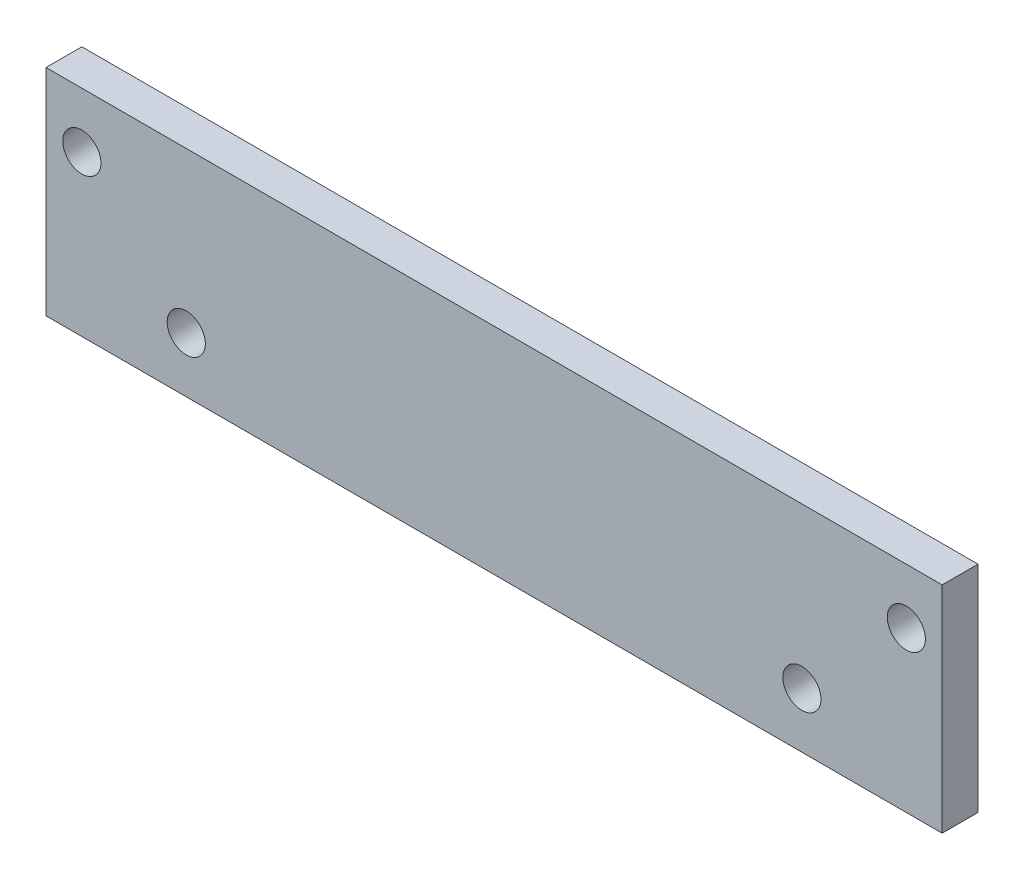
ISO-10303-21;
HEADER;
FILE_DESCRIPTION(('STEP AP214'),'2;1');
FILE_NAME('part.step','',(''),(''),'','','');
FILE_SCHEMA(('AUTOMOTIVE_DESIGN { 1 0 10303 214 1 1 1 1 }'));
ENDSEC;
DATA;
#1=APPLICATION_CONTEXT('core data for automotive mechanical design processes');
#2=APPLICATION_PROTOCOL_DEFINITION('international standard','automotive_design',2000,#1);
#3=PRODUCT_CONTEXT('',#1,'mechanical');
#4=PRODUCT('Part','Part','',(#3));
#5=PRODUCT_RELATED_PRODUCT_CATEGORY('part','',(#4));
#6=PRODUCT_DEFINITION_FORMATION('','',#4);
#7=PRODUCT_DEFINITION_CONTEXT('part definition',#1,'design');
#8=PRODUCT_DEFINITION('design','',#6,#7);
#9=PRODUCT_DEFINITION_SHAPE('','',#8);
#10=(LENGTH_UNIT() NAMED_UNIT(*) SI_UNIT(.MILLI.,.METRE.));
#11=(NAMED_UNIT(*) PLANE_ANGLE_UNIT() SI_UNIT($,.RADIAN.));
#12=(NAMED_UNIT(*) SI_UNIT($,.STERADIAN.) SOLID_ANGLE_UNIT());
#13=UNCERTAINTY_MEASURE_WITH_UNIT(LENGTH_MEASURE(1.E-05),#10,'distance_accuracy_value','');
#14=(GEOMETRIC_REPRESENTATION_CONTEXT(3) GLOBAL_UNCERTAINTY_ASSIGNED_CONTEXT((#13)) GLOBAL_UNIT_ASSIGNED_CONTEXT((#10,
#11,#12)) REPRESENTATION_CONTEXT('',''));
#15=CARTESIAN_POINT('',(0.,0.,0.));
#16=DIRECTION('',(0.,0.,1.));
#17=DIRECTION('',(1.,0.,0.));
#18=AXIS2_PLACEMENT_3D('',#15,#16,#17);
#19=CARTESIAN_POINT('',(0.,0.,6.35));
#20=DIRECTION('',(0.,0.,-1.));
#21=DIRECTION('',(-1.,0.,0.));
#22=AXIS2_PLACEMENT_3D('',#19,#20,#21);
#23=PLANE('',#22);
#24=DIRECTION('',(0.,1.,0.));
#25=VECTOR('',#24,1.);
#26=CARTESIAN_POINT('',(79.375,-19.05,6.35));
#27=LINE('',#26,#25);
#28=CARTESIAN_POINT('',(79.375,-19.05,6.35));
#29=VERTEX_POINT('',#28);
#30=CARTESIAN_POINT('',(79.375,19.05,6.35));
#31=VERTEX_POINT('',#30);
#32=EDGE_CURVE('E87',#29,#31,#27,.T.);
#33=ORIENTED_EDGE('',*,*,#32,.T.);
#34=DIRECTION('',(-1.,0.,0.));
#35=VECTOR('',#34,1.);
#36=CARTESIAN_POINT('',(-79.375,19.05,6.35));
#37=LINE('',#36,#35);
#38=CARTESIAN_POINT('',(-79.375,19.05,6.35));
#39=VERTEX_POINT('',#38);
#40=EDGE_CURVE('E82',#31,#39,#37,.T.);
#41=ORIENTED_EDGE('',*,*,#40,.T.);
#42=DIRECTION('',(0.,-1.,0.));
#43=VECTOR('',#42,1.);
#44=CARTESIAN_POINT('',(-79.375,-19.05,6.35));
#45=LINE('',#44,#43);
#46=CARTESIAN_POINT('',(-79.375,-19.05,6.35));
#47=VERTEX_POINT('',#46);
#48=EDGE_CURVE('E85',#39,#47,#45,.T.);
#49=ORIENTED_EDGE('',*,*,#48,.T.);
#50=DIRECTION('',(1.,0.,0.));
#51=VECTOR('',#50,1.);
#52=CARTESIAN_POINT('',(-79.375,-19.05,6.35));
#53=LINE('',#52,#51);
#54=EDGE_CURVE('E52',#47,#29,#53,.T.);
#55=ORIENTED_EDGE('',*,*,#54,.T.);
#56=EDGE_LOOP('',(#33,#41,#49,#55));
#57=FACE_BOUND('',#56,.T.);
#58=CARTESIAN_POINT('',(-54.5256723905975,-9.24966380470121,6.35));
#59=DIRECTION('',(0.,0.,1.));
#60=DIRECTION('',(1.,0.,0.));
#61=AXIS2_PLACEMENT_3D('',#58,#59,#60);
#62=CIRCLE('',#61,3.37819999999998);
#63=CARTESIAN_POINT('',(-51.1474723905975,-9.24966380470121,6.35));
#64=VERTEX_POINT('',#63);
#65=EDGE_CURVE('E116',#64,#64,#62,.T.);
#66=ORIENTED_EDGE('',*,*,#65,.F.);
#67=EDGE_LOOP('',(#66));
#68=FACE_BOUND('',#67,.T.);
#69=CARTESIAN_POINT('',(-73.025,9.24966380470121,6.35));
#70=DIRECTION('',(0.,0.,1.));
#71=DIRECTION('',(1.,0.,0.));
#72=AXIS2_PLACEMENT_3D('',#69,#70,#71);
#73=CIRCLE('',#72,3.37819999999998);
#74=CARTESIAN_POINT('',(-69.6468,9.24966380470121,6.35));
#75=VERTEX_POINT('',#74);
#76=EDGE_CURVE('E122',#75,#75,#73,.T.);
#77=ORIENTED_EDGE('',*,*,#76,.F.);
#78=EDGE_LOOP('',(#77));
#79=FACE_BOUND('',#78,.T.);
#80=CARTESIAN_POINT('',(54.5256723905975,-9.24966380470121,6.35));
#81=DIRECTION('',(0.,0.,1.));
#82=DIRECTION('',(1.,0.,0.));
#83=AXIS2_PLACEMENT_3D('',#80,#81,#82);
#84=CIRCLE('',#83,3.37819999999998);
#85=CARTESIAN_POINT('',(57.9038723905975,-9.24966380470121,6.35));
#86=VERTEX_POINT('',#85);
#87=EDGE_CURVE('E128',#86,#86,#84,.T.);
#88=ORIENTED_EDGE('',*,*,#87,.F.);
#89=EDGE_LOOP('',(#88));
#90=FACE_BOUND('',#89,.T.);
#91=CARTESIAN_POINT('',(73.025,9.24966380470121,6.35));
#92=DIRECTION('',(0.,0.,1.));
#93=DIRECTION('',(1.,0.,0.));
#94=AXIS2_PLACEMENT_3D('',#91,#92,#93);
#95=CIRCLE('',#94,3.37819999999998);
#96=CARTESIAN_POINT('',(76.4032,9.24966380470121,6.35));
#97=VERTEX_POINT('',#96);
#98=EDGE_CURVE('E134',#97,#97,#95,.T.);
#99=ORIENTED_EDGE('',*,*,#98,.F.);
#100=EDGE_LOOP('',(#99));
#101=FACE_BOUND('',#100,.T.);
#102=ADVANCED_FACE('F35',(#57,#68,#79,#90,#101),#23,.F.);
#103=CARTESIAN_POINT('',(0.,0.,0.));
#104=DIRECTION('',(0.,0.,-1.));
#105=DIRECTION('',(-1.,0.,0.));
#106=AXIS2_PLACEMENT_3D('',#103,#104,#105);
#107=PLANE('',#106);
#108=CARTESIAN_POINT('',(73.025,9.24966380470121,0.));
#109=DIRECTION('',(0.,0.,1.));
#110=DIRECTION('',(1.,0.,0.));
#111=AXIS2_PLACEMENT_3D('',#108,#109,#110);
#112=CIRCLE('',#111,3.3782);
#113=CARTESIAN_POINT('',(76.4032,9.24966380470121,0.));
#114=VERTEX_POINT('',#113);
#115=EDGE_CURVE('E131',#114,#114,#112,.T.);
#116=ORIENTED_EDGE('',*,*,#115,.T.);
#117=EDGE_LOOP('',(#116));
#118=FACE_BOUND('',#117,.T.);
#119=DIRECTION('',(0.,1.,0.));
#120=VECTOR('',#119,1.);
#121=CARTESIAN_POINT('',(79.375,-19.05,0.));
#122=LINE('',#121,#120);
#123=CARTESIAN_POINT('',(79.375,-19.05,0.));
#124=VERTEX_POINT('',#123);
#125=CARTESIAN_POINT('',(79.375,19.05,0.));
#126=VERTEX_POINT('',#125);
#127=EDGE_CURVE('E99',#124,#126,#122,.T.);
#128=ORIENTED_EDGE('',*,*,#127,.F.);
#129=DIRECTION('',(1.,0.,0.));
#130=VECTOR('',#129,1.);
#131=CARTESIAN_POINT('',(-79.375,-19.05,0.));
#132=LINE('',#131,#130);
#133=CARTESIAN_POINT('',(-79.375,-19.05,0.));
#134=VERTEX_POINT('',#133);
#135=EDGE_CURVE('E75',#134,#124,#132,.T.);
#136=ORIENTED_EDGE('',*,*,#135,.F.);
#137=DIRECTION('',(0.,-1.,0.));
#138=VECTOR('',#137,1.);
#139=CARTESIAN_POINT('',(-79.375,-19.05,0.));
#140=LINE('',#139,#138);
#141=CARTESIAN_POINT('',(-79.375,19.05,0.));
#142=VERTEX_POINT('',#141);
#143=EDGE_CURVE('E69',#142,#134,#140,.T.);
#144=ORIENTED_EDGE('',*,*,#143,.F.);
#145=DIRECTION('',(-1.,0.,0.));
#146=VECTOR('',#145,1.);
#147=CARTESIAN_POINT('',(-79.375,19.05,0.));
#148=LINE('',#147,#146);
#149=EDGE_CURVE('E91',#126,#142,#148,.T.);
#150=ORIENTED_EDGE('',*,*,#149,.F.);
#151=EDGE_LOOP('',(#128,#136,#144,#150));
#152=FACE_BOUND('',#151,.T.);
#153=CARTESIAN_POINT('',(-54.5256723905975,-9.24966380470121,0.));
#154=DIRECTION('',(0.,0.,1.));
#155=DIRECTION('',(1.,0.,0.));
#156=AXIS2_PLACEMENT_3D('',#153,#154,#155);
#157=CIRCLE('',#156,3.3782);
#158=CARTESIAN_POINT('',(-51.1474723905975,-9.24966380470121,0.));
#159=VERTEX_POINT('',#158);
#160=EDGE_CURVE('E102',#159,#159,#157,.T.);
#161=ORIENTED_EDGE('',*,*,#160,.T.);
#162=EDGE_LOOP('',(#161));
#163=FACE_BOUND('',#162,.T.);
#164=CARTESIAN_POINT('',(-73.025,9.24966380470121,0.));
#165=DIRECTION('',(0.,0.,1.));
#166=DIRECTION('',(1.,0.,0.));
#167=AXIS2_PLACEMENT_3D('',#164,#165,#166);
#168=CIRCLE('',#167,3.3782);
#169=CARTESIAN_POINT('',(-69.6468,9.24966380470121,0.));
#170=VERTEX_POINT('',#169);
#171=EDGE_CURVE('E119',#170,#170,#168,.T.);
#172=ORIENTED_EDGE('',*,*,#171,.T.);
#173=EDGE_LOOP('',(#172));
#174=FACE_BOUND('',#173,.T.);
#175=CARTESIAN_POINT('',(54.5256723905975,-9.24966380470121,0.));
#176=DIRECTION('',(0.,0.,1.));
#177=DIRECTION('',(1.,0.,0.));
#178=AXIS2_PLACEMENT_3D('',#175,#176,#177);
#179=CIRCLE('',#178,3.3782);
#180=CARTESIAN_POINT('',(57.9038723905975,-9.24966380470121,0.));
#181=VERTEX_POINT('',#180);
#182=EDGE_CURVE('E125',#181,#181,#179,.T.);
#183=ORIENTED_EDGE('',*,*,#182,.T.);
#184=EDGE_LOOP('',(#183));
#185=FACE_BOUND('',#184,.T.);
#186=ADVANCED_FACE('F110',(#118,#152,#163,#174,#185),#107,.T.);
#187=CARTESIAN_POINT('',(79.375,-19.05,6.35));
#188=DIRECTION('',(-1.,0.,0.));
#189=DIRECTION('',(0.,0.,1.));
#190=AXIS2_PLACEMENT_3D('',#187,#188,#189);
#191=PLANE('',#190);
#192=ORIENTED_EDGE('',*,*,#127,.T.);
#193=DIRECTION('',(0.,0.,-1.));
#194=VECTOR('',#193,1.);
#195=CARTESIAN_POINT('',(79.375,19.05,6.35));
#196=LINE('',#195,#194);
#197=EDGE_CURVE('E11',#31,#126,#196,.T.);
#198=ORIENTED_EDGE('',*,*,#197,.F.);
#199=ORIENTED_EDGE('',*,*,#32,.F.);
#200=DIRECTION('',(0.,0.,-1.));
#201=VECTOR('',#200,1.);
#202=CARTESIAN_POINT('',(79.375,-19.05,6.35));
#203=LINE('',#202,#201);
#204=EDGE_CURVE('E95',#29,#124,#203,.T.);
#205=ORIENTED_EDGE('',*,*,#204,.T.);
#206=EDGE_LOOP('',(#192,#198,#199,#205));
#207=FACE_BOUND('',#206,.T.);
#208=ADVANCED_FACE('F37',(#207),#191,.F.);
#209=CARTESIAN_POINT('',(-79.375,19.05,6.35));
#210=DIRECTION('',(0.,-1.,0.));
#211=DIRECTION('',(0.,0.,-1.));
#212=AXIS2_PLACEMENT_3D('',#209,#210,#211);
#213=PLANE('',#212);
#214=ORIENTED_EDGE('',*,*,#149,.T.);
#215=DIRECTION('',(0.,0.,-1.));
#216=VECTOR('',#215,1.);
#217=CARTESIAN_POINT('',(-79.375,19.05,6.35));
#218=LINE('',#217,#216);
#219=EDGE_CURVE('E44',#39,#142,#218,.T.);
#220=ORIENTED_EDGE('',*,*,#219,.F.);
#221=ORIENTED_EDGE('',*,*,#40,.F.);
#222=ORIENTED_EDGE('',*,*,#197,.T.);
#223=EDGE_LOOP('',(#214,#220,#221,#222));
#224=FACE_BOUND('',#223,.T.);
#225=ADVANCED_FACE('F90',(#224),#213,.F.);
#226=CARTESIAN_POINT('',(-79.375,-19.05,6.35));
#227=DIRECTION('',(1.,0.,0.));
#228=DIRECTION('',(0.,0.,-1.));
#229=AXIS2_PLACEMENT_3D('',#226,#227,#228);
#230=PLANE('',#229);
#231=ORIENTED_EDGE('',*,*,#143,.T.);
#232=DIRECTION('',(0.,0.,-1.));
#233=VECTOR('',#232,1.);
#234=CARTESIAN_POINT('',(-79.375,-19.05,6.35));
#235=LINE('',#234,#233);
#236=EDGE_CURVE('E92',#47,#134,#235,.T.);
#237=ORIENTED_EDGE('',*,*,#236,.F.);
#238=ORIENTED_EDGE('',*,*,#48,.F.);
#239=ORIENTED_EDGE('',*,*,#219,.T.);
#240=EDGE_LOOP('',(#231,#237,#238,#239));
#241=FACE_BOUND('',#240,.T.);
#242=ADVANCED_FACE('F93',(#241),#230,.F.);
#243=CARTESIAN_POINT('',(-79.375,-19.05,6.35));
#244=DIRECTION('',(0.,1.,0.));
#245=DIRECTION('',(0.,0.,1.));
#246=AXIS2_PLACEMENT_3D('',#243,#244,#245);
#247=PLANE('',#246);
#248=ORIENTED_EDGE('',*,*,#135,.T.);
#249=ORIENTED_EDGE('',*,*,#204,.F.);
#250=ORIENTED_EDGE('',*,*,#54,.F.);
#251=ORIENTED_EDGE('',*,*,#236,.T.);
#252=EDGE_LOOP('',(#248,#249,#250,#251));
#253=FACE_BOUND('',#252,.T.);
#254=ADVANCED_FACE('F107',(#253),#247,.F.);
#255=CARTESIAN_POINT('',(-54.5256723905975,-9.24966380470121,6.35));
#256=DIRECTION('',(0.,0.,1.));
#257=DIRECTION('',(1.,0.,0.));
#258=AXIS2_PLACEMENT_3D('',#255,#256,#257);
#259=CYLINDRICAL_SURFACE('',#258,3.37819999999999);
#260=ORIENTED_EDGE('',*,*,#160,.F.);
#261=EDGE_LOOP('',(#260));
#262=FACE_BOUND('',#261,.T.);
#263=ORIENTED_EDGE('',*,*,#65,.T.);
#264=EDGE_LOOP('',(#263));
#265=FACE_BOUND('',#264,.T.);
#266=ADVANCED_FACE('F148',(#262,#265),#259,.F.);
#267=CARTESIAN_POINT('',(-73.025,9.24966380470121,6.35));
#268=DIRECTION('',(0.,0.,1.));
#269=DIRECTION('',(1.,0.,0.));
#270=AXIS2_PLACEMENT_3D('',#267,#268,#269);
#271=CYLINDRICAL_SURFACE('',#270,3.37819999999999);
#272=ORIENTED_EDGE('',*,*,#171,.F.);
#273=EDGE_LOOP('',(#272));
#274=FACE_BOUND('',#273,.T.);
#275=ORIENTED_EDGE('',*,*,#76,.T.);
#276=EDGE_LOOP('',(#275));
#277=FACE_BOUND('',#276,.T.);
#278=ADVANCED_FACE('F178',(#274,#277),#271,.F.);
#279=CARTESIAN_POINT('',(54.5256723905975,-9.24966380470121,6.35));
#280=DIRECTION('',(0.,0.,1.));
#281=DIRECTION('',(1.,0.,0.));
#282=AXIS2_PLACEMENT_3D('',#279,#280,#281);
#283=CYLINDRICAL_SURFACE('',#282,3.37819999999999);
#284=ORIENTED_EDGE('',*,*,#182,.F.);
#285=EDGE_LOOP('',(#284));
#286=FACE_BOUND('',#285,.T.);
#287=ORIENTED_EDGE('',*,*,#87,.T.);
#288=EDGE_LOOP('',(#287));
#289=FACE_BOUND('',#288,.T.);
#290=ADVANCED_FACE('F173',(#286,#289),#283,.F.);
#291=CARTESIAN_POINT('',(73.025,9.24966380470121,6.35));
#292=DIRECTION('',(0.,0.,1.));
#293=DIRECTION('',(1.,0.,0.));
#294=AXIS2_PLACEMENT_3D('',#291,#292,#293);
#295=CYLINDRICAL_SURFACE('',#294,3.37819999999999);
#296=ORIENTED_EDGE('',*,*,#115,.F.);
#297=EDGE_LOOP('',(#296));
#298=FACE_BOUND('',#297,.T.);
#299=ORIENTED_EDGE('',*,*,#98,.T.);
#300=EDGE_LOOP('',(#299));
#301=FACE_BOUND('',#300,.T.);
#302=ADVANCED_FACE('F138',(#298,#301),#295,.F.);
#303=CLOSED_SHELL('',(#102,#186,#208,#225,#242,#254,#266,#278,#290,#302));
#304=MANIFOLD_SOLID_BREP('B2',#303);
#305=ADVANCED_BREP_SHAPE_REPRESENTATION('',(#18,#304),#14);
#306=SHAPE_DEFINITION_REPRESENTATION(#9,#305);
ENDSEC;
END-ISO-10303-21;
